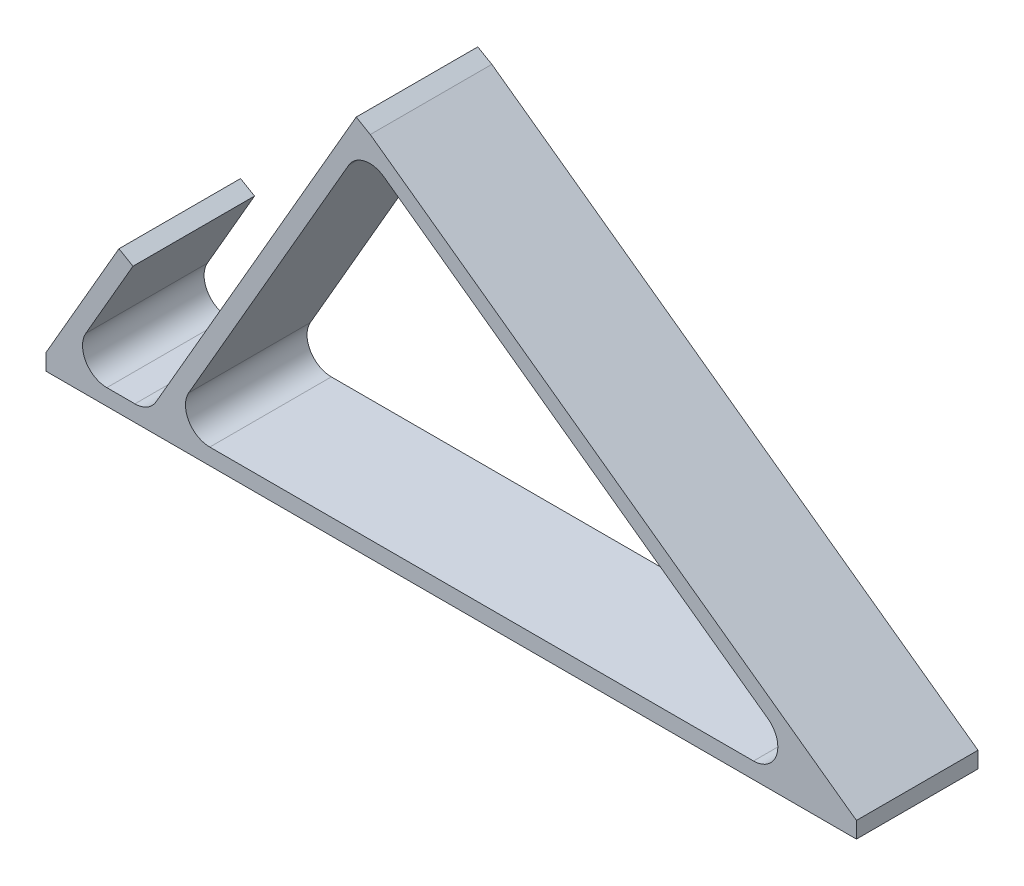
ISO-10303-21;
HEADER;
FILE_DESCRIPTION(('STEP AP214'),'2;1');
FILE_NAME('part.step','',(''),(''),'','','');
FILE_SCHEMA(('AUTOMOTIVE_DESIGN { 1 0 10303 214 1 1 1 1 }'));
ENDSEC;
DATA;
#1=APPLICATION_CONTEXT('core data for automotive mechanical design processes');
#2=APPLICATION_PROTOCOL_DEFINITION('international standard','automotive_design',2000,#1);
#3=PRODUCT_CONTEXT('',#1,'mechanical');
#4=PRODUCT('Part','Part','',(#3));
#5=PRODUCT_RELATED_PRODUCT_CATEGORY('part','',(#4));
#6=PRODUCT_DEFINITION_FORMATION('','',#4);
#7=PRODUCT_DEFINITION_CONTEXT('part definition',#1,'design');
#8=PRODUCT_DEFINITION('design','',#6,#7);
#9=PRODUCT_DEFINITION_SHAPE('','',#8);
#10=(LENGTH_UNIT() NAMED_UNIT(*) SI_UNIT(.MILLI.,.METRE.));
#11=(NAMED_UNIT(*) PLANE_ANGLE_UNIT() SI_UNIT($,.RADIAN.));
#12=(NAMED_UNIT(*) SI_UNIT($,.STERADIAN.) SOLID_ANGLE_UNIT());
#13=UNCERTAINTY_MEASURE_WITH_UNIT(LENGTH_MEASURE(1.E-05),#10,'distance_accuracy_value','');
#14=(GEOMETRIC_REPRESENTATION_CONTEXT(3) GLOBAL_UNCERTAINTY_ASSIGNED_CONTEXT((#13)) GLOBAL_UNIT_ASSIGNED_CONTEXT((#10,
#11,#12)) REPRESENTATION_CONTEXT('',''));
#15=CARTESIAN_POINT('',(0.,0.,0.));
#16=DIRECTION('',(0.,0.,1.));
#17=DIRECTION('',(1.,0.,0.));
#18=AXIS2_PLACEMENT_3D('',#15,#16,#17);
#19=CARTESIAN_POINT('',(10.9696551146029,5.,15.));
#20=DIRECTION('',(0.,0.,-1.));
#21=DIRECTION('',(-1.,0.,0.));
#22=AXIS2_PLACEMENT_3D('',#19,#20,#21);
#23=PLANE('',#22);
#24=DIRECTION('',(0.,-1.,0.));
#25=VECTOR('',#24,1.);
#26=CARTESIAN_POINT('',(0.,2.,15.));
#27=LINE('',#26,#25);
#28=CARTESIAN_POINT('',(0.,2.,15.));
#29=VERTEX_POINT('',#28);
#30=CARTESIAN_POINT('',(0.,0.,15.));
#31=VERTEX_POINT('',#30);
#32=EDGE_CURVE('E209',#29,#31,#27,.T.);
#33=ORIENTED_EDGE('',*,*,#32,.T.);
#34=DIRECTION('',(1.,0.,0.));
#35=VECTOR('',#34,1.);
#36=CARTESIAN_POINT('',(0.,0.,15.));
#37=LINE('',#36,#35);
#38=CARTESIAN_POINT('',(100.,0.,15.));
#39=VERTEX_POINT('',#38);
#40=EDGE_CURVE('E212',#31,#39,#37,.T.);
#41=ORIENTED_EDGE('',*,*,#40,.T.);
#42=DIRECTION('',(0.,1.,0.));
#43=VECTOR('',#42,1.);
#44=CARTESIAN_POINT('',(100.,0.,15.));
#45=LINE('',#44,#43);
#46=CARTESIAN_POINT('',(100.,2.00000000000001,15.));
#47=VERTEX_POINT('',#46);
#48=EDGE_CURVE('E215',#39,#47,#45,.T.);
#49=ORIENTED_EDGE('',*,*,#48,.T.);
#50=DIRECTION('',(-0.810833437744609,0.585276973949308,0.));
#51=VECTOR('',#50,1.);
#52=CARTESIAN_POINT('',(40.0111069989301,45.301270189222,15.));
#53=LINE('',#52,#51);
#54=CARTESIAN_POINT('',(40.0111069989301,45.301270189222,15.));
#55=VERTEX_POINT('',#54);
#56=EDGE_CURVE('E217',#47,#55,#53,.T.);
#57=ORIENTED_EDGE('',*,*,#56,.T.);
#58=DIRECTION('',(-0.86602540378444,0.499999999999998,0.));
#59=VECTOR('',#58,1.);
#60=CARTESIAN_POINT('',(38.2790561913612,46.301270189222,15.));
#61=LINE('',#60,#59);
#62=CARTESIAN_POINT('',(38.2790561913612,46.301270189222,15.));
#63=VERTEX_POINT('',#62);
#64=EDGE_CURVE('E219',#55,#63,#61,.T.);
#65=ORIENTED_EDGE('',*,*,#64,.T.);
#66=DIRECTION('',(-0.499999999999998,-0.86602540378444,0.));
#67=VECTOR('',#66,1.);
#68=CARTESIAN_POINT('',(38.2790561913612,46.301270189222,15.));
#69=LINE('',#68,#67);
#70=CARTESIAN_POINT('',(13.5677313259562,3.50000000000002,15.));
#71=VERTEX_POINT('',#70);
#72=EDGE_CURVE('E221',#63,#71,#69,.T.);
#73=ORIENTED_EDGE('',*,*,#72,.T.);
#74=CARTESIAN_POINT('',(10.9696551146029,5.,15.));
#75=DIRECTION('',(0.,0.,-1.));
#76=DIRECTION('',(-1.,0.,0.));
#77=AXIS2_PLACEMENT_3D('',#74,#75,#76);
#78=CIRCLE('',#77,3.);
#79=CARTESIAN_POINT('',(10.9696551146028,2.,15.));
#80=VERTEX_POINT('',#79);
#81=EDGE_CURVE('E223',#71,#80,#78,.T.);
#82=ORIENTED_EDGE('',*,*,#81,.T.);
#83=DIRECTION('',(-1.,0.,0.));
#84=VECTOR('',#83,1.);
#85=CARTESIAN_POINT('',(7.50555349946516,2.,15.));
#86=LINE('',#85,#84);
#87=CARTESIAN_POINT('',(7.50555349946516,2.,15.));
#88=VERTEX_POINT('',#87);
#89=EDGE_CURVE('E225',#80,#88,#86,.T.);
#90=ORIENTED_EDGE('',*,*,#89,.T.);
#91=CARTESIAN_POINT('',(7.50555349946512,5.,15.));
#92=DIRECTION('',(0.,0.,-1.));
#93=DIRECTION('',(1.,0.,0.));
#94=AXIS2_PLACEMENT_3D('',#91,#92,#93);
#95=CIRCLE('',#94,3.);
#96=CARTESIAN_POINT('',(4.90747728811182,6.50000000000003,15.));
#97=VERTEX_POINT('',#96);
#98=EDGE_CURVE('E227',#88,#97,#95,.T.);
#99=ORIENTED_EDGE('',*,*,#98,.T.);
#100=DIRECTION('',(0.499999999999997,0.86602540378444,0.));
#101=VECTOR('',#100,1.);
#102=CARTESIAN_POINT('',(4.90747728811182,6.50000000000003,15.));
#103=LINE('',#102,#101);
#104=CARTESIAN_POINT('',(10.7320508075688,16.5884572681199,15.));
#105=VERTEX_POINT('',#104);
#106=EDGE_CURVE('E229',#97,#105,#103,.T.);
#107=ORIENTED_EDGE('',*,*,#106,.T.);
#108=DIRECTION('',(-0.866025403784439,0.499999999999999,0.));
#109=VECTOR('',#108,1.);
#110=CARTESIAN_POINT('',(10.7320508075688,16.5884572681199,15.));
#111=LINE('',#110,#109);
#112=CARTESIAN_POINT('',(8.99999999999996,17.5884572681199,15.));
#113=VERTEX_POINT('',#112);
#114=EDGE_CURVE('E231',#105,#113,#111,.T.);
#115=ORIENTED_EDGE('',*,*,#114,.T.);
#116=DIRECTION('',(-0.499999999999998,-0.86602540378444,0.));
#117=VECTOR('',#116,1.);
#118=CARTESIAN_POINT('',(0.,2.,15.));
#119=LINE('',#118,#117);
#120=EDGE_CURVE('E233',#113,#29,#119,.T.);
#121=ORIENTED_EDGE('',*,*,#120,.T.);
#122=EDGE_LOOP('',(#33,#41,#49,#57,#65,#73,#82,#90,#99,#107,#115,#121));
#123=FACE_BOUND('',#122,.T.);
#124=CARTESIAN_POINT('',(87.3008837797238,5.00000000000001,15.));
#125=DIRECTION('',(0.,0.,1.));
#126=DIRECTION('',(-1.,0.,0.));
#127=AXIS2_PLACEMENT_3D('',#124,#125,#126);
#128=CIRCLE('',#127,3.);
#129=CARTESIAN_POINT('',(87.3008837797237,2.00000000000001,15.));
#130=VERTEX_POINT('',#129);
#131=CARTESIAN_POINT('',(89.0567147015717,7.4325003132339,15.));
#132=VERTEX_POINT('',#131);
#133=EDGE_CURVE('E158',#130,#132,#128,.T.);
#134=ORIENTED_EDGE('',*,*,#133,.F.);
#135=DIRECTION('',(1.,0.,0.));
#136=VECTOR('',#135,1.);
#137=CARTESIAN_POINT('',(87.3008837797237,2.00000000000001,15.));
#138=LINE('',#137,#136);
#139=CARTESIAN_POINT('',(20.2072594216369,2.,15.));
#140=VERTEX_POINT('',#139);
#141=EDGE_CURVE('E187',#140,#130,#138,.T.);
#142=ORIENTED_EDGE('',*,*,#141,.F.);
#143=CARTESIAN_POINT('',(20.2072594216369,5.,15.));
#144=DIRECTION('',(0.,0.,1.));
#145=DIRECTION('',(1.,0.,0.));
#146=AXIS2_PLACEMENT_3D('',#143,#144,#145);
#147=CIRCLE('',#146,3.);
#148=CARTESIAN_POINT('',(17.6091832102836,6.50000000000003,15.));
#149=VERTEX_POINT('',#148);
#150=EDGE_CURVE('E185',#149,#140,#147,.T.);
#151=ORIENTED_EDGE('',*,*,#150,.F.);
#152=DIRECTION('',(-0.499999999999998,-0.86602540378444,0.));
#153=VECTOR('',#152,1.);
#154=CARTESIAN_POINT('',(37.3451810533317,40.6837510022294,15.));
#155=LINE('',#154,#153);
#156=CARTESIAN_POINT('',(37.3451810533317,40.6837510022294,15.));
#157=VERTEX_POINT('',#156);
#158=EDGE_CURVE('E181',#157,#149,#155,.T.);
#159=ORIENTED_EDGE('',*,*,#158,.F.);
#160=CARTESIAN_POINT('',(39.943257264685,39.1837510022295,15.));
#161=DIRECTION('',(0.,0.,1.));
#162=DIRECTION('',(-1.,0.,0.));
#163=AXIS2_PLACEMENT_3D('',#160,#161,#162);
#164=CIRCLE('',#163,3.);
#165=CARTESIAN_POINT('',(41.699088186533,41.6162513154633,15.));
#166=VERTEX_POINT('',#165);
#167=EDGE_CURVE('E179',#166,#157,#164,.T.);
#168=ORIENTED_EDGE('',*,*,#167,.F.);
#169=DIRECTION('',(-0.810833437744609,0.585276973949308,0.));
#170=VECTOR('',#169,1.);
#171=CARTESIAN_POINT('',(41.699088186533,41.6162513154633,15.));
#172=LINE('',#171,#170);
#173=EDGE_CURVE('E166',#132,#166,#172,.T.);
#174=ORIENTED_EDGE('',*,*,#173,.F.);
#175=EDGE_LOOP('',(#134,#142,#151,#159,#168,#174));
#176=FACE_BOUND('',#175,.T.);
#177=ADVANCED_FACE('F33',(#123,#176),#23,.F.);
#178=CARTESIAN_POINT('',(10.9696551146029,5.,0.));
#179=DIRECTION('',(0.,0.,-1.));
#180=DIRECTION('',(-1.,0.,0.));
#181=AXIS2_PLACEMENT_3D('',#178,#179,#180);
#182=PLANE('',#181);
#183=DIRECTION('',(0.,-1.,0.));
#184=VECTOR('',#183,1.);
#185=CARTESIAN_POINT('',(0.,2.,0.));
#186=LINE('',#185,#184);
#187=CARTESIAN_POINT('',(0.,2.,0.));
#188=VERTEX_POINT('',#187);
#189=CARTESIAN_POINT('',(0.,0.,0.));
#190=VERTEX_POINT('',#189);
#191=EDGE_CURVE('E174',#188,#190,#186,.T.);
#192=ORIENTED_EDGE('',*,*,#191,.F.);
#193=DIRECTION('',(-0.499999999999998,-0.86602540378444,0.));
#194=VECTOR('',#193,1.);
#195=CARTESIAN_POINT('',(0.,2.,0.));
#196=LINE('',#195,#194);
#197=CARTESIAN_POINT('',(8.99999999999996,17.5884572681199,0.));
#198=VERTEX_POINT('',#197);
#199=EDGE_CURVE('E213',#198,#188,#196,.T.);
#200=ORIENTED_EDGE('',*,*,#199,.F.);
#201=DIRECTION('',(-0.866025403784439,0.499999999999999,0.));
#202=VECTOR('',#201,1.);
#203=CARTESIAN_POINT('',(10.7320508075688,16.5884572681199,0.));
#204=LINE('',#203,#202);
#205=CARTESIAN_POINT('',(10.7320508075688,16.5884572681199,0.));
#206=VERTEX_POINT('',#205);
#207=EDGE_CURVE('E256',#206,#198,#204,.T.);
#208=ORIENTED_EDGE('',*,*,#207,.F.);
#209=DIRECTION('',(0.499999999999997,0.86602540378444,0.));
#210=VECTOR('',#209,1.);
#211=CARTESIAN_POINT('',(4.90747728811182,6.50000000000003,0.));
#212=LINE('',#211,#210);
#213=CARTESIAN_POINT('',(4.90747728811182,6.50000000000003,0.));
#214=VERTEX_POINT('',#213);
#215=EDGE_CURVE('E254',#214,#206,#212,.T.);
#216=ORIENTED_EDGE('',*,*,#215,.F.);
#217=CARTESIAN_POINT('',(7.50555349946512,5.,0.));
#218=DIRECTION('',(0.,0.,-1.));
#219=DIRECTION('',(1.,0.,0.));
#220=AXIS2_PLACEMENT_3D('',#217,#218,#219);
#221=CIRCLE('',#220,3.);
#222=CARTESIAN_POINT('',(7.50555349946516,2.,0.));
#223=VERTEX_POINT('',#222);
#224=EDGE_CURVE('E252',#223,#214,#221,.T.);
#225=ORIENTED_EDGE('',*,*,#224,.F.);
#226=DIRECTION('',(-1.,0.,0.));
#227=VECTOR('',#226,1.);
#228=CARTESIAN_POINT('',(7.50555349946516,2.,0.));
#229=LINE('',#228,#227);
#230=CARTESIAN_POINT('',(10.9696551146028,2.,0.));
#231=VERTEX_POINT('',#230);
#232=EDGE_CURVE('E250',#231,#223,#229,.T.);
#233=ORIENTED_EDGE('',*,*,#232,.F.);
#234=CARTESIAN_POINT('',(10.9696551146029,5.,0.));
#235=DIRECTION('',(0.,0.,-1.));
#236=DIRECTION('',(-1.,0.,0.));
#237=AXIS2_PLACEMENT_3D('',#234,#235,#236);
#238=CIRCLE('',#237,3.);
#239=CARTESIAN_POINT('',(13.5677313259562,3.50000000000002,0.));
#240=VERTEX_POINT('',#239);
#241=EDGE_CURVE('E248',#240,#231,#238,.T.);
#242=ORIENTED_EDGE('',*,*,#241,.F.);
#243=DIRECTION('',(-0.499999999999998,-0.86602540378444,0.));
#244=VECTOR('',#243,1.);
#245=CARTESIAN_POINT('',(38.2790561913612,46.301270189222,0.));
#246=LINE('',#245,#244);
#247=CARTESIAN_POINT('',(38.2790561913612,46.301270189222,0.));
#248=VERTEX_POINT('',#247);
#249=EDGE_CURVE('E246',#248,#240,#246,.T.);
#250=ORIENTED_EDGE('',*,*,#249,.F.);
#251=DIRECTION('',(-0.86602540378444,0.499999999999998,0.));
#252=VECTOR('',#251,1.);
#253=CARTESIAN_POINT('',(38.2790561913612,46.301270189222,0.));
#254=LINE('',#253,#252);
#255=CARTESIAN_POINT('',(40.0111069989301,45.301270189222,0.));
#256=VERTEX_POINT('',#255);
#257=EDGE_CURVE('E244',#256,#248,#254,.T.);
#258=ORIENTED_EDGE('',*,*,#257,.F.);
#259=DIRECTION('',(-0.810833437744609,0.585276973949308,0.));
#260=VECTOR('',#259,1.);
#261=CARTESIAN_POINT('',(40.0111069989301,45.301270189222,0.));
#262=LINE('',#261,#260);
#263=CARTESIAN_POINT('',(100.,2.00000000000001,0.));
#264=VERTEX_POINT('',#263);
#265=EDGE_CURVE('E242',#264,#256,#262,.T.);
#266=ORIENTED_EDGE('',*,*,#265,.F.);
#267=DIRECTION('',(0.,1.,0.));
#268=VECTOR('',#267,1.);
#269=CARTESIAN_POINT('',(100.,0.,0.));
#270=LINE('',#269,#268);
#271=CARTESIAN_POINT('',(100.,0.,0.));
#272=VERTEX_POINT('',#271);
#273=EDGE_CURVE('E240',#272,#264,#270,.T.);
#274=ORIENTED_EDGE('',*,*,#273,.F.);
#275=DIRECTION('',(1.,0.,0.));
#276=VECTOR('',#275,1.);
#277=CARTESIAN_POINT('',(0.,0.,0.));
#278=LINE('',#277,#276);
#279=EDGE_CURVE('E238',#190,#272,#278,.T.);
#280=ORIENTED_EDGE('',*,*,#279,.F.);
#281=EDGE_LOOP('',(#192,#200,#208,#216,#225,#233,#242,#250,#258,#266,#274,#280));
#282=FACE_BOUND('',#281,.T.);
#283=DIRECTION('',(1.,0.,0.));
#284=VECTOR('',#283,1.);
#285=CARTESIAN_POINT('',(87.3008837797237,2.00000000000001,0.));
#286=LINE('',#285,#284);
#287=CARTESIAN_POINT('',(20.2072594216369,2.,0.));
#288=VERTEX_POINT('',#287);
#289=CARTESIAN_POINT('',(87.3008837797237,2.00000000000001,0.));
#290=VERTEX_POINT('',#289);
#291=EDGE_CURVE('E167',#288,#290,#286,.T.);
#292=ORIENTED_EDGE('',*,*,#291,.T.);
#293=CARTESIAN_POINT('',(87.3008837797238,5.00000000000001,0.));
#294=DIRECTION('',(0.,0.,1.));
#295=DIRECTION('',(-1.,0.,0.));
#296=AXIS2_PLACEMENT_3D('',#293,#294,#295);
#297=CIRCLE('',#296,3.);
#298=CARTESIAN_POINT('',(89.0567147015717,7.4325003132339,0.));
#299=VERTEX_POINT('',#298);
#300=EDGE_CURVE('E56',#290,#299,#297,.T.);
#301=ORIENTED_EDGE('',*,*,#300,.T.);
#302=DIRECTION('',(-0.810833437744609,0.585276973949308,0.));
#303=VECTOR('',#302,1.);
#304=CARTESIAN_POINT('',(41.699088186533,41.6162513154633,0.));
#305=LINE('',#304,#303);
#306=CARTESIAN_POINT('',(41.699088186533,41.6162513154633,0.));
#307=VERTEX_POINT('',#306);
#308=EDGE_CURVE('E173',#299,#307,#305,.T.);
#309=ORIENTED_EDGE('',*,*,#308,.T.);
#310=CARTESIAN_POINT('',(39.943257264685,39.1837510022295,0.));
#311=DIRECTION('',(0.,0.,1.));
#312=DIRECTION('',(-1.,0.,0.));
#313=AXIS2_PLACEMENT_3D('',#310,#311,#312);
#314=CIRCLE('',#313,3.);
#315=CARTESIAN_POINT('',(37.3451810533317,40.6837510022294,0.));
#316=VERTEX_POINT('',#315);
#317=EDGE_CURVE('E191',#307,#316,#314,.T.);
#318=ORIENTED_EDGE('',*,*,#317,.T.);
#319=DIRECTION('',(-0.499999999999998,-0.86602540378444,0.));
#320=VECTOR('',#319,1.);
#321=CARTESIAN_POINT('',(37.3451810533317,40.6837510022294,0.));
#322=LINE('',#321,#320);
#323=CARTESIAN_POINT('',(17.6091832102836,6.50000000000003,0.));
#324=VERTEX_POINT('',#323);
#325=EDGE_CURVE('E194',#316,#324,#322,.T.);
#326=ORIENTED_EDGE('',*,*,#325,.T.);
#327=CARTESIAN_POINT('',(20.2072594216369,5.,0.));
#328=DIRECTION('',(0.,0.,1.));
#329=DIRECTION('',(1.,0.,0.));
#330=AXIS2_PLACEMENT_3D('',#327,#328,#329);
#331=CIRCLE('',#330,3.);
#332=EDGE_CURVE('E197',#324,#288,#331,.T.);
#333=ORIENTED_EDGE('',*,*,#332,.T.);
#334=EDGE_LOOP('',(#292,#301,#309,#318,#326,#333));
#335=FACE_BOUND('',#334,.T.);
#336=ADVANCED_FACE('F298',(#282,#335),#182,.T.);
#337=CARTESIAN_POINT('',(0.,2.,15.));
#338=DIRECTION('',(1.,0.,0.));
#339=DIRECTION('',(0.,1.,0.));
#340=AXIS2_PLACEMENT_3D('',#337,#338,#339);
#341=PLANE('',#340);
#342=ORIENTED_EDGE('',*,*,#191,.T.);
#343=DIRECTION('',(0.,0.,-1.));
#344=VECTOR('',#343,1.);
#345=CARTESIAN_POINT('',(0.,0.,15.));
#346=LINE('',#345,#344);
#347=EDGE_CURVE('E11',#31,#190,#346,.T.);
#348=ORIENTED_EDGE('',*,*,#347,.F.);
#349=ORIENTED_EDGE('',*,*,#32,.F.);
#350=DIRECTION('',(0.,0.,-1.));
#351=VECTOR('',#350,1.);
#352=CARTESIAN_POINT('',(0.,2.,15.));
#353=LINE('',#352,#351);
#354=EDGE_CURVE('E235',#29,#188,#353,.T.);
#355=ORIENTED_EDGE('',*,*,#354,.T.);
#356=EDGE_LOOP('',(#342,#348,#349,#355));
#357=FACE_BOUND('',#356,.T.);
#358=ADVANCED_FACE('F35',(#357),#341,.F.);
#359=CARTESIAN_POINT('',(0.,0.,15.));
#360=DIRECTION('',(0.,1.,0.));
#361=DIRECTION('',(0.,0.,1.));
#362=AXIS2_PLACEMENT_3D('',#359,#360,#361);
#363=PLANE('',#362);
#364=ORIENTED_EDGE('',*,*,#279,.T.);
#365=DIRECTION('',(0.,0.,-1.));
#366=VECTOR('',#365,1.);
#367=CARTESIAN_POINT('',(100.,0.,15.));
#368=LINE('',#367,#366);
#369=EDGE_CURVE('E41',#39,#272,#368,.T.);
#370=ORIENTED_EDGE('',*,*,#369,.F.);
#371=ORIENTED_EDGE('',*,*,#40,.F.);
#372=ORIENTED_EDGE('',*,*,#347,.T.);
#373=EDGE_LOOP('',(#364,#370,#371,#372));
#374=FACE_BOUND('',#373,.T.);
#375=ADVANCED_FACE('F315',(#374),#363,.F.);
#376=CARTESIAN_POINT('',(100.,0.,15.));
#377=DIRECTION('',(-1.,0.,0.));
#378=DIRECTION('',(0.,0.,1.));
#379=AXIS2_PLACEMENT_3D('',#376,#377,#378);
#380=PLANE('',#379);
#381=ORIENTED_EDGE('',*,*,#273,.T.);
#382=DIRECTION('',(0.,0.,-1.));
#383=VECTOR('',#382,1.);
#384=CARTESIAN_POINT('',(100.,2.00000000000001,15.));
#385=LINE('',#384,#383);
#386=EDGE_CURVE('E285',#47,#264,#385,.T.);
#387=ORIENTED_EDGE('',*,*,#386,.F.);
#388=ORIENTED_EDGE('',*,*,#48,.F.);
#389=ORIENTED_EDGE('',*,*,#369,.T.);
#390=EDGE_LOOP('',(#381,#387,#388,#389));
#391=FACE_BOUND('',#390,.T.);
#392=ADVANCED_FACE('F292',(#391),#380,.F.);
#393=CARTESIAN_POINT('',(40.0111069989301,45.301270189222,15.));
#394=DIRECTION('',(-0.585276973949308,-0.810833437744609,0.));
#395=DIRECTION('',(0.810833437744609,-0.585276973949308,0.));
#396=AXIS2_PLACEMENT_3D('',#393,#394,#395);
#397=PLANE('',#396);
#398=ORIENTED_EDGE('',*,*,#265,.T.);
#399=DIRECTION('',(0.,0.,-1.));
#400=VECTOR('',#399,1.);
#401=CARTESIAN_POINT('',(40.0111069989301,45.301270189222,15.));
#402=LINE('',#401,#400);
#403=EDGE_CURVE('E282',#55,#256,#402,.T.);
#404=ORIENTED_EDGE('',*,*,#403,.F.);
#405=ORIENTED_EDGE('',*,*,#56,.F.);
#406=ORIENTED_EDGE('',*,*,#386,.T.);
#407=EDGE_LOOP('',(#398,#404,#405,#406));
#408=FACE_BOUND('',#407,.T.);
#409=ADVANCED_FACE('F304',(#408),#397,.F.);
#410=CARTESIAN_POINT('',(38.2790561913612,46.301270189222,15.));
#411=DIRECTION('',(-0.499999999999997,-0.86602540378444,0.));
#412=DIRECTION('',(0.86602540378444,-0.499999999999997,0.));
#413=AXIS2_PLACEMENT_3D('',#410,#411,#412);
#414=PLANE('',#413);
#415=ORIENTED_EDGE('',*,*,#257,.T.);
#416=DIRECTION('',(0.,0.,-1.));
#417=VECTOR('',#416,1.);
#418=CARTESIAN_POINT('',(38.2790561913612,46.301270189222,15.));
#419=LINE('',#418,#417);
#420=EDGE_CURVE('E279',#63,#248,#419,.T.);
#421=ORIENTED_EDGE('',*,*,#420,.F.);
#422=ORIENTED_EDGE('',*,*,#64,.F.);
#423=ORIENTED_EDGE('',*,*,#403,.T.);
#424=EDGE_LOOP('',(#415,#421,#422,#423));
#425=FACE_BOUND('',#424,.T.);
#426=ADVANCED_FACE('F308',(#425),#414,.F.);
#427=CARTESIAN_POINT('',(38.2790561913612,46.301270189222,15.));
#428=DIRECTION('',(0.86602540378444,-0.499999999999998,0.));
#429=DIRECTION('',(0.499999999999998,0.86602540378444,0.));
#430=AXIS2_PLACEMENT_3D('',#427,#428,#429);
#431=PLANE('',#430);
#432=ORIENTED_EDGE('',*,*,#249,.T.);
#433=DIRECTION('',(0.,0.,-1.));
#434=VECTOR('',#433,1.);
#435=CARTESIAN_POINT('',(13.5677313259562,3.50000000000002,15.));
#436=LINE('',#435,#434);
#437=EDGE_CURVE('E276',#71,#240,#436,.T.);
#438=ORIENTED_EDGE('',*,*,#437,.F.);
#439=ORIENTED_EDGE('',*,*,#72,.F.);
#440=ORIENTED_EDGE('',*,*,#420,.T.);
#441=EDGE_LOOP('',(#432,#438,#439,#440));
#442=FACE_BOUND('',#441,.T.);
#443=ADVANCED_FACE('F348',(#442),#431,.F.);
#444=CARTESIAN_POINT('',(10.9696551146029,5.,15.));
#445=DIRECTION('',(0.,0.,-1.));
#446=DIRECTION('',(-1.,0.,0.));
#447=AXIS2_PLACEMENT_3D('',#444,#445,#446);
#448=CYLINDRICAL_SURFACE('',#447,3.);
#449=ORIENTED_EDGE('',*,*,#241,.T.);
#450=DIRECTION('',(0.,0.,-1.));
#451=VECTOR('',#450,1.);
#452=CARTESIAN_POINT('',(10.9696551146028,2.,15.));
#453=LINE('',#452,#451);
#454=EDGE_CURVE('E273',#80,#231,#453,.T.);
#455=ORIENTED_EDGE('',*,*,#454,.F.);
#456=ORIENTED_EDGE('',*,*,#81,.F.);
#457=ORIENTED_EDGE('',*,*,#437,.T.);
#458=EDGE_LOOP('',(#449,#455,#456,#457));
#459=FACE_BOUND('',#458,.T.);
#460=ADVANCED_FACE('F346',(#459),#448,.F.);
#461=CARTESIAN_POINT('',(7.50555349946516,2.,15.));
#462=DIRECTION('',(0.,-1.,0.));
#463=DIRECTION('',(1.,0.,0.));
#464=AXIS2_PLACEMENT_3D('',#461,#462,#463);
#465=PLANE('',#464);
#466=ORIENTED_EDGE('',*,*,#232,.T.);
#467=DIRECTION('',(0.,0.,-1.));
#468=VECTOR('',#467,1.);
#469=CARTESIAN_POINT('',(7.50555349946516,2.,15.));
#470=LINE('',#469,#468);
#471=EDGE_CURVE('E270',#88,#223,#470,.T.);
#472=ORIENTED_EDGE('',*,*,#471,.F.);
#473=ORIENTED_EDGE('',*,*,#89,.F.);
#474=ORIENTED_EDGE('',*,*,#454,.T.);
#475=EDGE_LOOP('',(#466,#472,#473,#474));
#476=FACE_BOUND('',#475,.T.);
#477=ADVANCED_FACE('F342',(#476),#465,.F.);
#478=CARTESIAN_POINT('',(7.50555349946512,5.,15.));
#479=DIRECTION('',(0.,0.,-1.));
#480=DIRECTION('',(-1.,0.,0.));
#481=AXIS2_PLACEMENT_3D('',#478,#479,#480);
#482=CYLINDRICAL_SURFACE('',#481,3.);
#483=ORIENTED_EDGE('',*,*,#224,.T.);
#484=DIRECTION('',(0.,0.,-1.));
#485=VECTOR('',#484,1.);
#486=CARTESIAN_POINT('',(4.90747728811182,6.50000000000003,15.));
#487=LINE('',#486,#485);
#488=EDGE_CURVE('E267',#97,#214,#487,.T.);
#489=ORIENTED_EDGE('',*,*,#488,.F.);
#490=ORIENTED_EDGE('',*,*,#98,.F.);
#491=ORIENTED_EDGE('',*,*,#471,.T.);
#492=EDGE_LOOP('',(#483,#489,#490,#491));
#493=FACE_BOUND('',#492,.T.);
#494=ADVANCED_FACE('F337',(#493),#482,.F.);
#495=CARTESIAN_POINT('',(4.90747728811182,6.50000000000003,15.));
#496=DIRECTION('',(-0.86602540378444,0.499999999999997,0.));
#497=DIRECTION('',(-0.499999999999997,-0.86602540378444,0.));
#498=AXIS2_PLACEMENT_3D('',#495,#496,#497);
#499=PLANE('',#498);
#500=ORIENTED_EDGE('',*,*,#215,.T.);
#501=DIRECTION('',(0.,0.,-1.));
#502=VECTOR('',#501,1.);
#503=CARTESIAN_POINT('',(10.7320508075688,16.5884572681199,15.));
#504=LINE('',#503,#502);
#505=EDGE_CURVE('E264',#105,#206,#504,.T.);
#506=ORIENTED_EDGE('',*,*,#505,.F.);
#507=ORIENTED_EDGE('',*,*,#106,.F.);
#508=ORIENTED_EDGE('',*,*,#488,.T.);
#509=EDGE_LOOP('',(#500,#506,#507,#508));
#510=FACE_BOUND('',#509,.T.);
#511=ADVANCED_FACE('F331',(#510),#499,.F.);
#512=CARTESIAN_POINT('',(10.7320508075688,16.5884572681199,15.));
#513=DIRECTION('',(-0.499999999999999,-0.866025403784439,0.));
#514=DIRECTION('',(0.866025403784439,-0.499999999999999,0.));
#515=AXIS2_PLACEMENT_3D('',#512,#513,#514);
#516=PLANE('',#515);
#517=ORIENTED_EDGE('',*,*,#207,.T.);
#518=DIRECTION('',(0.,0.,-1.));
#519=VECTOR('',#518,1.);
#520=CARTESIAN_POINT('',(8.99999999999996,17.5884572681199,15.));
#521=LINE('',#520,#519);
#522=EDGE_CURVE('E261',#113,#198,#521,.T.);
#523=ORIENTED_EDGE('',*,*,#522,.F.);
#524=ORIENTED_EDGE('',*,*,#114,.F.);
#525=ORIENTED_EDGE('',*,*,#505,.T.);
#526=EDGE_LOOP('',(#517,#523,#524,#525));
#527=FACE_BOUND('',#526,.T.);
#528=ADVANCED_FACE('F327',(#527),#516,.F.);
#529=CARTESIAN_POINT('',(0.,2.,15.));
#530=DIRECTION('',(0.86602540378444,-0.499999999999997,0.));
#531=DIRECTION('',(0.499999999999998,0.86602540378444,0.));
#532=AXIS2_PLACEMENT_3D('',#529,#530,#531);
#533=PLANE('',#532);
#534=ORIENTED_EDGE('',*,*,#199,.T.);
#535=ORIENTED_EDGE('',*,*,#354,.F.);
#536=ORIENTED_EDGE('',*,*,#120,.F.);
#537=ORIENTED_EDGE('',*,*,#522,.T.);
#538=EDGE_LOOP('',(#534,#535,#536,#537));
#539=FACE_BOUND('',#538,.T.);
#540=ADVANCED_FACE('F322',(#539),#533,.F.);
#541=CARTESIAN_POINT('',(87.3008837797238,5.00000000000001,15.));
#542=DIRECTION('',(0.,0.,-1.));
#543=DIRECTION('',(-1.,0.,0.));
#544=AXIS2_PLACEMENT_3D('',#541,#542,#543);
#545=CYLINDRICAL_SURFACE('',#544,3.);
#546=ORIENTED_EDGE('',*,*,#300,.F.);
#547=DIRECTION('',(0.,0.,-1.));
#548=VECTOR('',#547,1.);
#549=CARTESIAN_POINT('',(87.3008837797237,2.00000000000001,15.));
#550=LINE('',#549,#548);
#551=EDGE_CURVE('E162',#130,#290,#550,.T.);
#552=ORIENTED_EDGE('',*,*,#551,.F.);
#553=ORIENTED_EDGE('',*,*,#133,.T.);
#554=DIRECTION('',(0.,0.,-1.));
#555=VECTOR('',#554,1.);
#556=CARTESIAN_POINT('',(89.0567147015717,7.4325003132339,15.));
#557=LINE('',#556,#555);
#558=EDGE_CURVE('E161',#132,#299,#557,.T.);
#559=ORIENTED_EDGE('',*,*,#558,.T.);
#560=EDGE_LOOP('',(#546,#552,#553,#559));
#561=FACE_BOUND('',#560,.T.);
#562=ADVANCED_FACE('F160',(#561),#545,.F.);
#563=CARTESIAN_POINT('',(41.699088186533,41.6162513154633,15.));
#564=DIRECTION('',(-0.585276973949308,-0.810833437744609,0.));
#565=DIRECTION('',(0.810833437744609,-0.585276973949308,0.));
#566=AXIS2_PLACEMENT_3D('',#563,#564,#565);
#567=PLANE('',#566);
#568=ORIENTED_EDGE('',*,*,#308,.F.);
#569=ORIENTED_EDGE('',*,*,#558,.F.);
#570=ORIENTED_EDGE('',*,*,#173,.T.);
#571=DIRECTION('',(0.,0.,-1.));
#572=VECTOR('',#571,1.);
#573=CARTESIAN_POINT('',(41.699088186533,41.6162513154633,15.));
#574=LINE('',#573,#572);
#575=EDGE_CURVE('E175',#166,#307,#574,.T.);
#576=ORIENTED_EDGE('',*,*,#575,.T.);
#577=EDGE_LOOP('',(#568,#569,#570,#576));
#578=FACE_BOUND('',#577,.T.);
#579=ADVANCED_FACE('F170',(#578),#567,.T.);
#580=CARTESIAN_POINT('',(39.943257264685,39.1837510022295,15.));
#581=DIRECTION('',(0.,0.,-1.));
#582=DIRECTION('',(-1.,0.,0.));
#583=AXIS2_PLACEMENT_3D('',#580,#581,#582);
#584=CYLINDRICAL_SURFACE('',#583,3.);
#585=ORIENTED_EDGE('',*,*,#317,.F.);
#586=ORIENTED_EDGE('',*,*,#575,.F.);
#587=ORIENTED_EDGE('',*,*,#167,.T.);
#588=DIRECTION('',(0.,0.,-1.));
#589=VECTOR('',#588,1.);
#590=CARTESIAN_POINT('',(37.3451810533317,40.6837510022294,15.));
#591=LINE('',#590,#589);
#592=EDGE_CURVE('E206',#157,#316,#591,.T.);
#593=ORIENTED_EDGE('',*,*,#592,.T.);
#594=EDGE_LOOP('',(#585,#586,#587,#593));
#595=FACE_BOUND('',#594,.T.);
#596=ADVANCED_FACE('F406',(#595),#584,.F.);
#597=CARTESIAN_POINT('',(37.3451810533317,40.6837510022294,15.));
#598=DIRECTION('',(0.86602540378444,-0.499999999999998,0.));
#599=DIRECTION('',(0.499999999999998,0.86602540378444,0.));
#600=AXIS2_PLACEMENT_3D('',#597,#598,#599);
#601=PLANE('',#600);
#602=ORIENTED_EDGE('',*,*,#325,.F.);
#603=ORIENTED_EDGE('',*,*,#592,.F.);
#604=ORIENTED_EDGE('',*,*,#158,.T.);
#605=DIRECTION('',(0.,0.,-1.));
#606=VECTOR('',#605,1.);
#607=CARTESIAN_POINT('',(17.6091832102836,6.50000000000003,15.));
#608=LINE('',#607,#606);
#609=EDGE_CURVE('E204',#149,#324,#608,.T.);
#610=ORIENTED_EDGE('',*,*,#609,.T.);
#611=EDGE_LOOP('',(#602,#603,#604,#610));
#612=FACE_BOUND('',#611,.T.);
#613=ADVANCED_FACE('F412',(#612),#601,.T.);
#614=CARTESIAN_POINT('',(20.2072594216369,5.,15.));
#615=DIRECTION('',(0.,0.,-1.));
#616=DIRECTION('',(-1.,0.,0.));
#617=AXIS2_PLACEMENT_3D('',#614,#615,#616);
#618=CYLINDRICAL_SURFACE('',#617,3.);
#619=ORIENTED_EDGE('',*,*,#332,.F.);
#620=ORIENTED_EDGE('',*,*,#609,.F.);
#621=ORIENTED_EDGE('',*,*,#150,.T.);
#622=DIRECTION('',(0.,0.,-1.));
#623=VECTOR('',#622,1.);
#624=CARTESIAN_POINT('',(20.2072594216369,2.,15.));
#625=LINE('',#624,#623);
#626=EDGE_CURVE('E48',#140,#288,#625,.T.);
#627=ORIENTED_EDGE('',*,*,#626,.T.);
#628=EDGE_LOOP('',(#619,#620,#621,#627));
#629=FACE_BOUND('',#628,.T.);
#630=ADVANCED_FACE('F420',(#629),#618,.F.);
#631=CARTESIAN_POINT('',(87.3008837797237,2.00000000000001,15.));
#632=DIRECTION('',(0.,1.,0.));
#633=DIRECTION('',(-1.,0.,0.));
#634=AXIS2_PLACEMENT_3D('',#631,#632,#633);
#635=PLANE('',#634);
#636=ORIENTED_EDGE('',*,*,#291,.F.);
#637=ORIENTED_EDGE('',*,*,#626,.F.);
#638=ORIENTED_EDGE('',*,*,#141,.T.);
#639=ORIENTED_EDGE('',*,*,#551,.T.);
#640=EDGE_LOOP('',(#636,#637,#638,#639));
#641=FACE_BOUND('',#640,.T.);
#642=ADVANCED_FACE('F428',(#641),#635,.T.);
#643=CLOSED_SHELL('',(#177,#336,#358,#375,#392,#409,#426,#443,#460,#477,#494,#511,#528,#540,
#562,#579,#596,#613,#630,#642));
#644=MANIFOLD_SOLID_BREP('B2',#643);
#645=ADVANCED_BREP_SHAPE_REPRESENTATION('',(#18,#644),#14);
#646=SHAPE_DEFINITION_REPRESENTATION(#9,#645);
ENDSEC;
END-ISO-10303-21;
